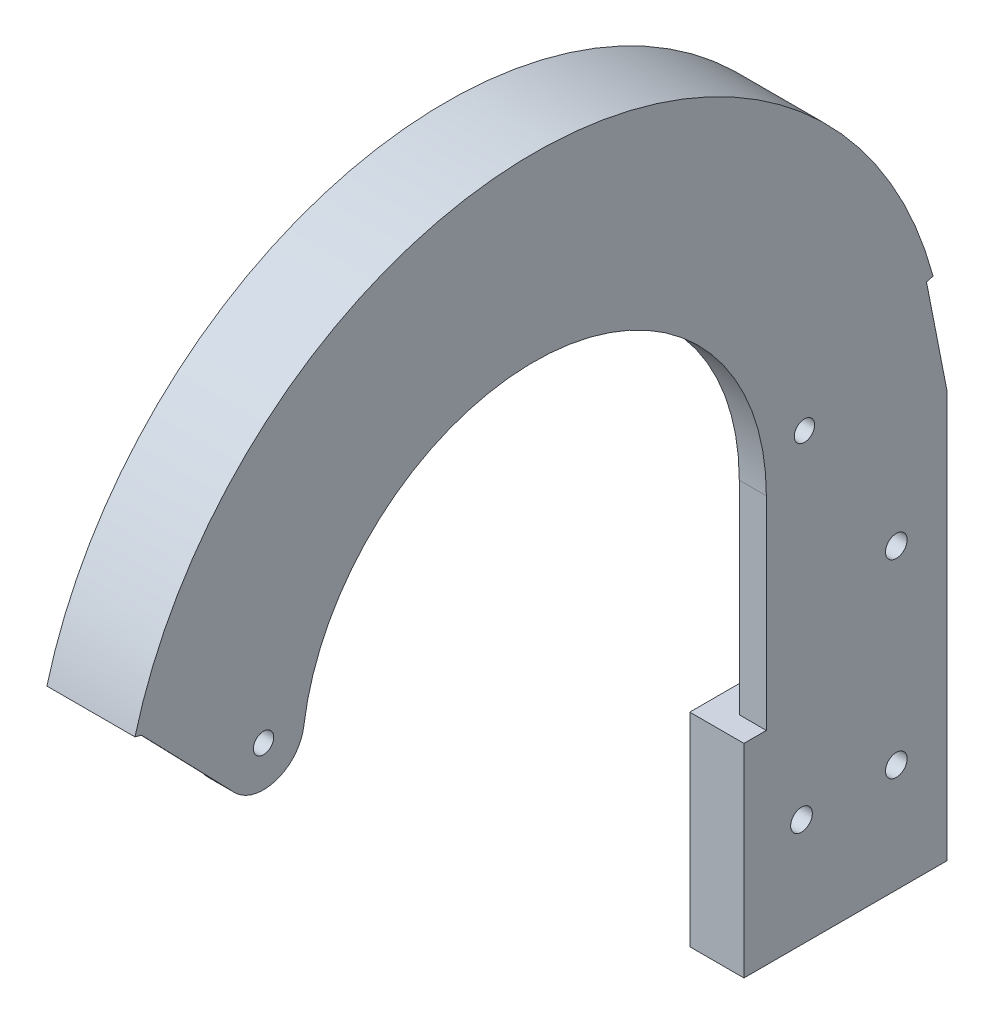
ISO-10303-21;
HEADER;
FILE_DESCRIPTION(('STEP AP214'),'2;1');
FILE_NAME('part.step','',(''),(''),'','','');
FILE_SCHEMA(('AUTOMOTIVE_DESIGN { 1 0 10303 214 1 1 1 1 }'));
ENDSEC;
DATA;
#1=APPLICATION_CONTEXT('core data for automotive mechanical design processes');
#2=APPLICATION_PROTOCOL_DEFINITION('international standard','automotive_design',2000,#1);
#3=PRODUCT_CONTEXT('',#1,'mechanical');
#4=PRODUCT('Part','Part','',(#3));
#5=PRODUCT_RELATED_PRODUCT_CATEGORY('part','',(#4));
#6=PRODUCT_DEFINITION_FORMATION('','',#4);
#7=PRODUCT_DEFINITION_CONTEXT('part definition',#1,'design');
#8=PRODUCT_DEFINITION('design','',#6,#7);
#9=PRODUCT_DEFINITION_SHAPE('','',#8);
#10=(LENGTH_UNIT() NAMED_UNIT(*) SI_UNIT(.MILLI.,.METRE.));
#11=(NAMED_UNIT(*) PLANE_ANGLE_UNIT() SI_UNIT($,.RADIAN.));
#12=(NAMED_UNIT(*) SI_UNIT($,.STERADIAN.) SOLID_ANGLE_UNIT());
#13=UNCERTAINTY_MEASURE_WITH_UNIT(LENGTH_MEASURE(1.E-05),#10,'distance_accuracy_value','');
#14=(GEOMETRIC_REPRESENTATION_CONTEXT(3) GLOBAL_UNCERTAINTY_ASSIGNED_CONTEXT((#13)) GLOBAL_UNIT_ASSIGNED_CONTEXT((#10,
#11,#12)) REPRESENTATION_CONTEXT('',''));
#15=CARTESIAN_POINT('',(0.,0.,0.));
#16=DIRECTION('',(0.,0.,1.));
#17=DIRECTION('',(1.,0.,0.));
#18=AXIS2_PLACEMENT_3D('',#15,#16,#17);
#19=CARTESIAN_POINT('',(-35.,0.,0.));
#20=DIRECTION('',(1.,0.,0.));
#21=DIRECTION('',(0.,0.,1.));
#22=AXIS2_PLACEMENT_3D('',#19,#20,#21);
#23=PLANE('',#22);
#24=CARTESIAN_POINT('',(-35.,65.5231326726555,-39.9311282770753));
#25=DIRECTION('',(-1.,0.,0.));
#26=DIRECTION('',(0.,0.,1.));
#27=AXIS2_PLACEMENT_3D('',#24,#25,#26);
#28=CIRCLE('',#27,1.5);
#29=CARTESIAN_POINT('',(-35.,65.5231326726555,-38.4311282770753));
#30=VERTEX_POINT('',#29);
#31=EDGE_CURVE('E269',#30,#30,#28,.T.);
#32=ORIENTED_EDGE('',*,*,#31,.F.);
#33=EDGE_LOOP('',(#32));
#34=FACE_BOUND('',#33,.T.);
#35=CARTESIAN_POINT('',(-35.,65.5231326726555,39.9311282770753));
#36=DIRECTION('',(-1.,0.,0.));
#37=DIRECTION('',(0.,0.,1.));
#38=AXIS2_PLACEMENT_3D('',#35,#36,#37);
#39=CIRCLE('',#38,1.5);
#40=CARTESIAN_POINT('',(-35.,65.5231326726555,41.4311282770753));
#41=VERTEX_POINT('',#40);
#42=EDGE_CURVE('E303',#41,#41,#39,.F.);
#43=ORIENTED_EDGE('',*,*,#42,.T.);
#44=EDGE_LOOP('',(#43));
#45=FACE_BOUND('',#44,.T.);
#46=DIRECTION('',(0.,0.,1.));
#47=VECTOR('',#46,1.);
#48=CARTESIAN_POINT('',(-35.,60.,-61.));
#49=LINE('',#48,#47);
#50=CARTESIAN_POINT('',(-35.,60.,-61.));
#51=VERTEX_POINT('',#50);
#52=CARTESIAN_POINT('',(-35.,60.,-46.));
#53=VERTEX_POINT('',#52);
#54=EDGE_CURVE('E206',#51,#53,#49,.T.);
#55=ORIENTED_EDGE('',*,*,#54,.T.);
#56=DIRECTION('',(0.,-1.,0.));
#57=VECTOR('',#56,1.);
#58=CARTESIAN_POINT('',(-35.,60.,-46.));
#59=LINE('',#58,#57);
#60=CARTESIAN_POINT('',(-35.,30.,-46.));
#61=VERTEX_POINT('',#60);
#62=EDGE_CURVE('E186',#53,#61,#59,.T.);
#63=ORIENTED_EDGE('',*,*,#62,.T.);
#64=DIRECTION('',(0.,0.,1.));
#65=VECTOR('',#64,1.);
#66=CARTESIAN_POINT('',(-35.,30.,-46.));
#67=LINE('',#66,#65);
#68=CARTESIAN_POINT('',(-35.,30.,-34.3112887414927));
#69=VERTEX_POINT('',#68);
#70=EDGE_CURVE('E195',#61,#69,#67,.T.);
#71=ORIENTED_EDGE('',*,*,#70,.T.);
#72=DIRECTION('',(0.,-1.,0.));
#73=VECTOR('',#72,1.);
#74=CARTESIAN_POINT('',(-35.,0.,-34.3112887414927));
#75=LINE('',#74,#73);
#76=CARTESIAN_POINT('',(-35.,60.,-34.3112887414928));
#77=VERTEX_POINT('',#76);
#78=EDGE_CURVE('E295',#77,#69,#75,.T.);
#79=ORIENTED_EDGE('',*,*,#78,.F.);
#80=CARTESIAN_POINT('',(-35.,60.,0.));
#81=DIRECTION('',(-1.,0.,0.));
#82=DIRECTION('',(0.,0.,1.));
#83=AXIS2_PLACEMENT_3D('',#80,#81,#82);
#84=CIRCLE('',#83,34.3112887414928);
#85=CARTESIAN_POINT('',(-35.,64.7010603184709,33.9877119998417));
#86=VERTEX_POINT('',#85);
#87=EDGE_CURVE('E297',#77,#86,#84,.F.);
#88=ORIENTED_EDGE('',*,*,#87,.T.);
#89=CARTESIAN_POINT('',(-35.,65.5231326726555,39.9311282770753));
#90=DIRECTION('',(-1.,0.,0.));
#91=DIRECTION('',(0.,0.,1.));
#92=AXIS2_PLACEMENT_3D('',#89,#90,#91);
#93=CIRCLE('',#92,6.00000000000001);
#94=CARTESIAN_POINT('',(-35.,66.3452050268401,45.874544554309));
#95=VERTEX_POINT('',#94);
#96=EDGE_CURVE('E300',#86,#95,#93,.T.);
#97=ORIENTED_EDGE('',*,*,#96,.T.);
#98=CARTESIAN_POINT('',(-35.,60.,0.));
#99=DIRECTION('',(-1.,0.,0.));
#100=DIRECTION('',(0.,0.,1.));
#101=AXIS2_PLACEMENT_3D('',#98,#99,#100);
#102=CIRCLE('',#101,46.3112887414928);
#103=CARTESIAN_POINT('',(-35.,90.1419665662354,-35.1595977852117));
#104=VERTEX_POINT('',#103);
#105=EDGE_CURVE('E261',#104,#95,#102,.F.);
#106=ORIENTED_EDGE('',*,*,#105,.F.);
#107=DIRECTION('',(0.,0.75920145477857,0.650855706790762));
#108=VECTOR('',#107,1.);
#109=CARTESIAN_POINT('',(-35.,55.5587556299615,-64.8074337520006));
#110=LINE('',#109,#108);
#111=EDGE_CURVE('E292',#51,#104,#110,.T.);
#112=ORIENTED_EDGE('',*,*,#111,.F.);
#113=EDGE_LOOP('',(#55,#63,#71,#79,#88,#97,#106,#112));
#114=FACE_BOUND('',#113,.T.);
#115=ADVANCED_FACE('F35',(#34,#45,#114),#23,.F.);
#116=CARTESIAN_POINT('',(-31.,60.,0.));
#117=DIRECTION('',(-1.,0.,0.));
#118=DIRECTION('',(0.,0.,-1.));
#119=AXIS2_PLACEMENT_3D('',#116,#117,#118);
#120=CYLINDRICAL_SURFACE('',#119,46.3112887414928);
#121=DIRECTION('',(-1.,0.,0.));
#122=VECTOR('',#121,1.);
#123=CARTESIAN_POINT('',(-31.,90.1419665662354,-35.1595977852117));
#124=LINE('',#123,#122);
#125=CARTESIAN_POINT('',(-34.,90.1419665662354,-35.1595977852117));
#126=VERTEX_POINT('',#125);
#127=EDGE_CURVE('E326',#126,#104,#124,.T.);
#128=ORIENTED_EDGE('',*,*,#127,.T.);
#129=ORIENTED_EDGE('',*,*,#105,.T.);
#130=DIRECTION('',(-1.,0.,0.));
#131=VECTOR('',#130,1.);
#132=CARTESIAN_POINT('',(-31.,66.3452050268401,45.874544554309));
#133=LINE('',#132,#131);
#134=CARTESIAN_POINT('',(-34.,66.3452050268401,45.874544554309));
#135=VERTEX_POINT('',#134);
#136=EDGE_CURVE('E289',#135,#95,#133,.T.);
#137=ORIENTED_EDGE('',*,*,#136,.F.);
#138=CARTESIAN_POINT('',(-34.,60.,0.));
#139=DIRECTION('',(-1.,0.,0.));
#140=DIRECTION('',(0.,0.,1.));
#141=AXIS2_PLACEMENT_3D('',#138,#139,#140);
#142=CIRCLE('',#141,46.3112887414928);
#143=EDGE_CURVE('E371',#126,#135,#142,.F.);
#144=ORIENTED_EDGE('',*,*,#143,.F.);
#145=EDGE_LOOP('',(#128,#129,#137,#144));
#146=FACE_BOUND('',#145,.T.);
#147=ADVANCED_FACE('F385',(#146),#120,.T.);
#148=CARTESIAN_POINT('',(-31.,55.5587556299615,-64.8074337520006));
#149=DIRECTION('',(0.,0.650855706790762,-0.75920145477857));
#150=DIRECTION('',(0.,-0.75920145477857,-0.650855706790762));
#151=AXIS2_PLACEMENT_3D('',#148,#149,#150);
#152=PLANE('',#151);
#153=DIRECTION('',(-1.,0.,0.));
#154=VECTOR('',#153,1.);
#155=CARTESIAN_POINT('',(-31.,60.,-61.));
#156=LINE('',#155,#154);
#157=CARTESIAN_POINT('',(-34.,60.,-61.));
#158=VERTEX_POINT('',#157);
#159=EDGE_CURVE('E323',#158,#51,#156,.T.);
#160=ORIENTED_EDGE('',*,*,#159,.T.);
#161=ORIENTED_EDGE('',*,*,#111,.T.);
#162=ORIENTED_EDGE('',*,*,#127,.F.);
#163=DIRECTION('',(0.,-0.75920145477857,-0.650855706790762));
#164=VECTOR('',#163,1.);
#165=CARTESIAN_POINT('',(-34.,55.5587556299615,-64.8074337520006));
#166=LINE('',#165,#164);
#167=EDGE_CURVE('E438',#158,#126,#166,.F.);
#168=ORIENTED_EDGE('',*,*,#167,.F.);
#169=EDGE_LOOP('',(#160,#161,#162,#168));
#170=FACE_BOUND('',#169,.T.);
#171=ADVANCED_FACE('F390',(#170),#152,.T.);
#172=CARTESIAN_POINT('',(-31.,65.5231326726555,39.9311282770753));
#173=DIRECTION('',(-1.,0.,0.));
#174=DIRECTION('',(0.,0.,-1.));
#175=AXIS2_PLACEMENT_3D('',#172,#173,#174);
#176=CYLINDRICAL_SURFACE('',#175,6.00000000000001);
#177=ORIENTED_EDGE('',*,*,#136,.T.);
#178=ORIENTED_EDGE('',*,*,#96,.F.);
#179=DIRECTION('',(-1.,0.,0.));
#180=VECTOR('',#179,1.);
#181=CARTESIAN_POINT('',(-31.,64.7010603184709,33.9877119998417));
#182=LINE('',#181,#180);
#183=CARTESIAN_POINT('',(-31.,64.7010603184709,33.9877119998417));
#184=VERTEX_POINT('',#183);
#185=EDGE_CURVE('E309',#184,#86,#182,.T.);
#186=ORIENTED_EDGE('',*,*,#185,.F.);
#187=CARTESIAN_POINT('',(-31.,65.5231326726555,39.9311282770753));
#188=DIRECTION('',(-1.,0.,0.));
#189=DIRECTION('',(0.,0.,1.));
#190=AXIS2_PLACEMENT_3D('',#187,#188,#189);
#191=CIRCLE('',#190,6.00000000000001);
#192=CARTESIAN_POINT('',(-31.,61.3519172032577,44.2440114783523));
#193=VERTEX_POINT('',#192);
#194=EDGE_CURVE('E280',#184,#193,#191,.T.);
#195=ORIENTED_EDGE('',*,*,#194,.T.);
#196=DIRECTION('',(1.,0.,0.));
#197=VECTOR('',#196,1.);
#198=CARTESIAN_POINT('',(-32.,61.3519172032577,44.2440114783523));
#199=LINE('',#198,#197);
#200=CARTESIAN_POINT('',(-34.,61.3519172032577,44.2440114783523));
#201=VERTEX_POINT('',#200);
#202=EDGE_CURVE('E258',#201,#193,#199,.T.);
#203=ORIENTED_EDGE('',*,*,#202,.F.);
#204=CARTESIAN_POINT('',(-34.,65.5231326726555,39.9311282770753));
#205=DIRECTION('',(-1.,0.,0.));
#206=DIRECTION('',(0.,0.,1.));
#207=AXIS2_PLACEMENT_3D('',#204,#205,#206);
#208=CIRCLE('',#207,6.00000000000001);
#209=EDGE_CURVE('E487',#135,#201,#208,.F.);
#210=ORIENTED_EDGE('',*,*,#209,.F.);
#211=EDGE_LOOP('',(#177,#178,#186,#195,#203,#210));
#212=FACE_BOUND('',#211,.T.);
#213=ADVANCED_FACE('F404',(#212),#176,.T.);
#214=CARTESIAN_POINT('',(-31.,0.,-61.));
#215=DIRECTION('',(0.,0.,1.));
#216=DIRECTION('',(-1.,0.,0.));
#217=AXIS2_PLACEMENT_3D('',#214,#215,#216);
#218=PLANE('',#217);
#219=ORIENTED_EDGE('',*,*,#159,.F.);
#220=CARTESIAN_POINT('',(-31.,60.,-61.));
#221=VERTEX_POINT('',#220);
#222=EDGE_CURVE('E324',#221,#158,#156,.T.);
#223=ORIENTED_EDGE('',*,*,#222,.F.);
#224=DIRECTION('',(0.,-1.,0.));
#225=VECTOR('',#224,1.);
#226=CARTESIAN_POINT('',(-31.,0.,-61.));
#227=LINE('',#226,#225);
#228=CARTESIAN_POINT('',(-31.,0.,-61.));
#229=VERTEX_POINT('',#228);
#230=EDGE_CURVE('E265',#221,#229,#227,.T.);
#231=ORIENTED_EDGE('',*,*,#230,.T.);
#232=DIRECTION('',(-1.,0.,0.));
#233=VECTOR('',#232,1.);
#234=CARTESIAN_POINT('',(-31.,0.,-61.));
#235=LINE('',#234,#233);
#236=CARTESIAN_POINT('',(-39.,0.,-61.));
#237=VERTEX_POINT('',#236);
#238=EDGE_CURVE('E320',#229,#237,#235,.T.);
#239=ORIENTED_EDGE('',*,*,#238,.T.);
#240=DIRECTION('',(0.,-1.,0.));
#241=VECTOR('',#240,1.);
#242=CARTESIAN_POINT('',(-39.,60.,-61.));
#243=LINE('',#242,#241);
#244=CARTESIAN_POINT('',(-39.,60.,-61.));
#245=VERTEX_POINT('',#244);
#246=EDGE_CURVE('E213',#245,#237,#243,.T.);
#247=ORIENTED_EDGE('',*,*,#246,.F.);
#248=DIRECTION('',(1.,0.,0.));
#249=VECTOR('',#248,1.);
#250=CARTESIAN_POINT('',(-106.082039324994,60.,-61.));
#251=LINE('',#250,#249);
#252=EDGE_CURVE('E192',#245,#51,#251,.T.);
#253=ORIENTED_EDGE('',*,*,#252,.T.);
#254=EDGE_LOOP('',(#219,#223,#231,#239,#247,#253));
#255=FACE_BOUND('',#254,.T.);
#256=ADVANCED_FACE('F407',(#255),#218,.F.);
#257=CARTESIAN_POINT('',(-31.,0.,0.));
#258=DIRECTION('',(0.,1.,0.));
#259=DIRECTION('',(0.,0.,-1.));
#260=AXIS2_PLACEMENT_3D('',#257,#258,#259);
#261=PLANE('',#260);
#262=ORIENTED_EDGE('',*,*,#238,.F.);
#263=DIRECTION('',(0.,0.,1.));
#264=VECTOR('',#263,1.);
#265=CARTESIAN_POINT('',(-31.,0.,0.));
#266=LINE('',#265,#264);
#267=CARTESIAN_POINT('',(-31.,0.,-31.));
#268=VERTEX_POINT('',#267);
#269=EDGE_CURVE('E268',#229,#268,#266,.T.);
#270=ORIENTED_EDGE('',*,*,#269,.T.);
#271=DIRECTION('',(-1.,0.,0.));
#272=VECTOR('',#271,1.);
#273=CARTESIAN_POINT('',(-31.,0.,-31.));
#274=LINE('',#273,#272);
#275=CARTESIAN_POINT('',(-39.,0.,-31.));
#276=VERTEX_POINT('',#275);
#277=EDGE_CURVE('E317',#268,#276,#274,.T.);
#278=ORIENTED_EDGE('',*,*,#277,.T.);
#279=DIRECTION('',(0.,0.,1.));
#280=VECTOR('',#279,1.);
#281=CARTESIAN_POINT('',(-39.,0.,-61.));
#282=LINE('',#281,#280);
#283=EDGE_CURVE('E216',#237,#276,#282,.T.);
#284=ORIENTED_EDGE('',*,*,#283,.F.);
#285=EDGE_LOOP('',(#262,#270,#278,#284));
#286=FACE_BOUND('',#285,.T.);
#287=ADVANCED_FACE('F421',(#286),#261,.F.);
#288=CARTESIAN_POINT('',(-31.,0.,-31.));
#289=DIRECTION('',(0.,0.,1.));
#290=DIRECTION('',(0.,1.,0.));
#291=AXIS2_PLACEMENT_3D('',#288,#289,#290);
#292=PLANE('',#291);
#293=ORIENTED_EDGE('',*,*,#277,.F.);
#294=DIRECTION('',(0.,-1.,0.));
#295=VECTOR('',#294,1.);
#296=CARTESIAN_POINT('',(-31.,0.,-31.));
#297=LINE('',#296,#295);
#298=CARTESIAN_POINT('',(-31.,30.,-31.));
#299=VERTEX_POINT('',#298);
#300=EDGE_CURVE('E272',#299,#268,#297,.T.);
#301=ORIENTED_EDGE('',*,*,#300,.F.);
#302=DIRECTION('',(-1.,0.,0.));
#303=VECTOR('',#302,1.);
#304=CARTESIAN_POINT('',(-31.,30.,-31.));
#305=LINE('',#304,#303);
#306=CARTESIAN_POINT('',(-39.,30.,-31.));
#307=VERTEX_POINT('',#306);
#308=EDGE_CURVE('E314',#299,#307,#305,.T.);
#309=ORIENTED_EDGE('',*,*,#308,.T.);
#310=DIRECTION('',(0.,1.,0.));
#311=VECTOR('',#310,1.);
#312=CARTESIAN_POINT('',(-39.,30.,-31.));
#313=LINE('',#312,#311);
#314=EDGE_CURVE('E454',#276,#307,#313,.T.);
#315=ORIENTED_EDGE('',*,*,#314,.F.);
#316=EDGE_LOOP('',(#293,#301,#309,#315));
#317=FACE_BOUND('',#316,.T.);
#318=ADVANCED_FACE('F418',(#317),#292,.T.);
#319=CARTESIAN_POINT('',(-31.,30.,0.));
#320=DIRECTION('',(0.,1.,0.));
#321=DIRECTION('',(0.,0.,-1.));
#322=AXIS2_PLACEMENT_3D('',#319,#320,#321);
#323=PLANE('',#322);
#324=ORIENTED_EDGE('',*,*,#308,.F.);
#325=DIRECTION('',(0.,0.,1.));
#326=VECTOR('',#325,1.);
#327=CARTESIAN_POINT('',(-31.,30.,0.));
#328=LINE('',#327,#326);
#329=CARTESIAN_POINT('',(-31.,30.,-34.3112887414927));
#330=VERTEX_POINT('',#329);
#331=EDGE_CURVE('E274',#330,#299,#328,.T.);
#332=ORIENTED_EDGE('',*,*,#331,.F.);
#333=DIRECTION('',(-1.,0.,0.));
#334=VECTOR('',#333,1.);
#335=CARTESIAN_POINT('',(-31.,30.,-34.3112887414927));
#336=LINE('',#335,#334);
#337=EDGE_CURVE('E200',#330,#69,#336,.T.);
#338=ORIENTED_EDGE('',*,*,#337,.T.);
#339=ORIENTED_EDGE('',*,*,#70,.F.);
#340=DIRECTION('',(1.,0.,0.));
#341=VECTOR('',#340,1.);
#342=CARTESIAN_POINT('',(-106.082039324994,30.,-46.));
#343=LINE('',#342,#341);
#344=CARTESIAN_POINT('',(-39.,30.,-46.));
#345=VERTEX_POINT('',#344);
#346=EDGE_CURVE('E182',#345,#61,#343,.T.);
#347=ORIENTED_EDGE('',*,*,#346,.F.);
#348=DIRECTION('',(0.,0.,-1.));
#349=VECTOR('',#348,1.);
#350=CARTESIAN_POINT('',(-39.,30.,-46.));
#351=LINE('',#350,#349);
#352=EDGE_CURVE('E450',#307,#345,#351,.T.);
#353=ORIENTED_EDGE('',*,*,#352,.F.);
#354=EDGE_LOOP('',(#324,#332,#338,#339,#347,#353));
#355=FACE_BOUND('',#354,.T.);
#356=ADVANCED_FACE('F197',(#355),#323,.T.);
#357=CARTESIAN_POINT('',(-31.,0.,-34.3112887414927));
#358=DIRECTION('',(0.,0.,1.));
#359=DIRECTION('',(0.,1.,0.));
#360=AXIS2_PLACEMENT_3D('',#357,#358,#359);
#361=PLANE('',#360);
#362=ORIENTED_EDGE('',*,*,#78,.T.);
#363=ORIENTED_EDGE('',*,*,#337,.F.);
#364=DIRECTION('',(0.,-1.,0.));
#365=VECTOR('',#364,1.);
#366=CARTESIAN_POINT('',(-31.,0.,-34.3112887414927));
#367=LINE('',#366,#365);
#368=CARTESIAN_POINT('',(-31.,60.,-34.3112887414928));
#369=VERTEX_POINT('',#368);
#370=EDGE_CURVE('E276',#369,#330,#367,.T.);
#371=ORIENTED_EDGE('',*,*,#370,.F.);
#372=DIRECTION('',(-1.,0.,0.));
#373=VECTOR('',#372,1.);
#374=CARTESIAN_POINT('',(-31.,60.,-34.3112887414928));
#375=LINE('',#374,#373);
#376=EDGE_CURVE('E311',#369,#77,#375,.T.);
#377=ORIENTED_EDGE('',*,*,#376,.T.);
#378=EDGE_LOOP('',(#362,#363,#371,#377));
#379=FACE_BOUND('',#378,.T.);
#380=ADVANCED_FACE('F411',(#379),#361,.T.);
#381=CARTESIAN_POINT('',(-31.,60.,0.));
#382=DIRECTION('',(-1.,0.,0.));
#383=DIRECTION('',(0.,0.,-1.));
#384=AXIS2_PLACEMENT_3D('',#381,#382,#383);
#385=CYLINDRICAL_SURFACE('',#384,34.3112887414928);
#386=ORIENTED_EDGE('',*,*,#87,.F.);
#387=ORIENTED_EDGE('',*,*,#376,.F.);
#388=CARTESIAN_POINT('',(-31.,60.,0.));
#389=DIRECTION('',(-1.,0.,0.));
#390=DIRECTION('',(0.,0.,1.));
#391=AXIS2_PLACEMENT_3D('',#388,#389,#390);
#392=CIRCLE('',#391,34.3112887414928);
#393=EDGE_CURVE('E278',#369,#184,#392,.F.);
#394=ORIENTED_EDGE('',*,*,#393,.T.);
#395=ORIENTED_EDGE('',*,*,#185,.T.);
#396=EDGE_LOOP('',(#386,#387,#394,#395));
#397=FACE_BOUND('',#396,.T.);
#398=ADVANCED_FACE('F402',(#397),#385,.F.);
#399=CARTESIAN_POINT('',(-31.,65.5231326726555,39.9311282770753));
#400=DIRECTION('',(-1.,0.,0.));
#401=DIRECTION('',(0.,0.,-1.));
#402=AXIS2_PLACEMENT_3D('',#399,#400,#401);
#403=CYLINDRICAL_SURFACE('',#402,1.5);
#404=CARTESIAN_POINT('',(-31.,65.5231326726555,39.9311282770753));
#405=DIRECTION('',(-1.,0.,0.));
#406=DIRECTION('',(0.,0.,1.));
#407=AXIS2_PLACEMENT_3D('',#404,#405,#406);
#408=CIRCLE('',#407,1.5);
#409=CARTESIAN_POINT('',(-31.,65.5231326726555,41.4311282770753));
#410=VERTEX_POINT('',#409);
#411=EDGE_CURVE('E283',#410,#410,#408,.F.);
#412=ORIENTED_EDGE('',*,*,#411,.T.);
#413=EDGE_LOOP('',(#412));
#414=FACE_BOUND('',#413,.T.);
#415=ORIENTED_EDGE('',*,*,#42,.F.);
#416=EDGE_LOOP('',(#415));
#417=FACE_BOUND('',#416,.T.);
#418=ADVANCED_FACE('F398',(#414,#417),#403,.F.);
#419=CARTESIAN_POINT('',(-31.,65.5231326726555,-39.9311282770753));
#420=DIRECTION('',(-1.,0.,0.));
#421=DIRECTION('',(0.,0.,-1.));
#422=AXIS2_PLACEMENT_3D('',#419,#420,#421);
#423=CYLINDRICAL_SURFACE('',#422,1.5);
#424=CARTESIAN_POINT('',(-31.,65.5231326726555,-39.9311282770753));
#425=DIRECTION('',(-1.,0.,0.));
#426=DIRECTION('',(0.,0.,1.));
#427=AXIS2_PLACEMENT_3D('',#424,#425,#426);
#428=CIRCLE('',#427,1.5);
#429=CARTESIAN_POINT('',(-31.,65.5231326726555,-38.4311282770753));
#430=VERTEX_POINT('',#429);
#431=EDGE_CURVE('E286',#430,#430,#428,.T.);
#432=ORIENTED_EDGE('',*,*,#431,.F.);
#433=EDGE_LOOP('',(#432));
#434=FACE_BOUND('',#433,.T.);
#435=ORIENTED_EDGE('',*,*,#31,.T.);
#436=EDGE_LOOP('',(#435));
#437=FACE_BOUND('',#436,.T.);
#438=ADVANCED_FACE('F395',(#434,#437),#423,.F.);
#439=CARTESIAN_POINT('',(-31.,0.,0.));
#440=DIRECTION('',(1.,0.,0.));
#441=DIRECTION('',(0.,0.,1.));
#442=AXIS2_PLACEMENT_3D('',#439,#440,#441);
#443=PLANE('',#442);
#444=CARTESIAN_POINT('',(-31.,44.,-53.5));
#445=DIRECTION('',(-1.,0.,0.));
#446=DIRECTION('',(0.,0.,1.));
#447=AXIS2_PLACEMENT_3D('',#444,#445,#446);
#448=CIRCLE('',#447,1.6);
#449=CARTESIAN_POINT('',(-31.,44.,-51.9));
#450=VERTEX_POINT('',#449);
#451=EDGE_CURVE('E463',#450,#450,#448,.T.);
#452=ORIENTED_EDGE('',*,*,#451,.T.);
#453=EDGE_LOOP('',(#452));
#454=FACE_BOUND('',#453,.T.);
#455=CARTESIAN_POINT('',(-31.,16.,-53.5));
#456=DIRECTION('',(-1.,0.,0.));
#457=DIRECTION('',(0.,0.,1.));
#458=AXIS2_PLACEMENT_3D('',#455,#456,#457);
#459=CIRCLE('',#458,1.6);
#460=CARTESIAN_POINT('',(-31.,16.,-51.9));
#461=VERTEX_POINT('',#460);
#462=EDGE_CURVE('E460',#461,#461,#459,.T.);
#463=ORIENTED_EDGE('',*,*,#462,.T.);
#464=EDGE_LOOP('',(#463));
#465=FACE_BOUND('',#464,.T.);
#466=CARTESIAN_POINT('',(-31.,16.,-39.5));
#467=DIRECTION('',(-1.,0.,0.));
#468=DIRECTION('',(0.,0.,1.));
#469=AXIS2_PLACEMENT_3D('',#466,#467,#468);
#470=CIRCLE('',#469,1.6);
#471=CARTESIAN_POINT('',(-31.,16.,-37.9));
#472=VERTEX_POINT('',#471);
#473=EDGE_CURVE('E457',#472,#472,#470,.T.);
#474=ORIENTED_EDGE('',*,*,#473,.T.);
#475=EDGE_LOOP('',(#474));
#476=FACE_BOUND('',#475,.T.);
#477=ORIENTED_EDGE('',*,*,#194,.F.);
#478=ORIENTED_EDGE('',*,*,#393,.F.);
#479=ORIENTED_EDGE('',*,*,#370,.T.);
#480=ORIENTED_EDGE('',*,*,#331,.T.);
#481=ORIENTED_EDGE('',*,*,#300,.T.);
#482=ORIENTED_EDGE('',*,*,#269,.F.);
#483=ORIENTED_EDGE('',*,*,#230,.F.);
#484=DIRECTION('',(0.,-0.981319470810539,-0.192385280643097));
#485=VECTOR('',#484,1.);
#486=CARTESIAN_POINT('',(-31.,13.7370025018251,-70.0697474388497));
#487=LINE('',#486,#485);
#488=CARTESIAN_POINT('',(-31.,75.5291427061513,-57.9555495773441));
#489=VERTEX_POINT('',#488);
#490=EDGE_CURVE('E252',#489,#221,#487,.T.);
#491=ORIENTED_EDGE('',*,*,#490,.F.);
#492=DIRECTION('',(0.,0.258819045102527,-0.965925826289067));
#493=VECTOR('',#492,1.);
#494=CARTESIAN_POINT('',(-31.,55.9807621135326,15.0000000000002));
#495=LINE('',#494,#493);
#496=CARTESIAN_POINT('',(-31.,75.7879617512538,-58.9214754036332));
#497=VERTEX_POINT('',#496);
#498=EDGE_CURVE('E220',#489,#497,#495,.T.);
#499=ORIENTED_EDGE('',*,*,#498,.T.);
#500=CARTESIAN_POINT('',(-31.,60.,0.));
#501=DIRECTION('',(-1.,0.,0.));
#502=DIRECTION('',(0.,0.,1.));
#503=AXIS2_PLACEMENT_3D('',#500,#501,#502);
#504=CIRCLE('',#503,61.);
#505=CARTESIAN_POINT('',(-31.,75.7879617512538,58.9214754036332));
#506=VERTEX_POINT('',#505);
#507=EDGE_CURVE('E232',#506,#497,#504,.T.);
#508=ORIENTED_EDGE('',*,*,#507,.F.);
#509=DIRECTION('',(0.,-0.258819045102527,-0.965925826289067));
#510=VECTOR('',#509,1.);
#511=CARTESIAN_POINT('',(-31.,55.9807621135326,-15.0000000000002));
#512=LINE('',#511,#510);
#513=CARTESIAN_POINT('',(-31.,75.5291427061513,57.9555495773441));
#514=VERTEX_POINT('',#513);
#515=EDGE_CURVE('E229',#506,#514,#512,.T.);
#516=ORIENTED_EDGE('',*,*,#515,.T.);
#517=DIRECTION('',(0.,-0.718813866879486,-0.695202578232964));
#518=VECTOR('',#517,1.);
#519=CARTESIAN_POINT('',(-31.,7.54211515049408,-7.79826934698205));
#520=LINE('',#519,#518);
#521=EDGE_CURVE('E241',#514,#193,#520,.T.);
#522=ORIENTED_EDGE('',*,*,#521,.T.);
#523=EDGE_LOOP('',(#477,#478,#479,#480,#481,#482,#483,#491,#499,#508,#516,#522));
#524=FACE_BOUND('',#523,.T.);
#525=ORIENTED_EDGE('',*,*,#411,.F.);
#526=EDGE_LOOP('',(#525));
#527=FACE_BOUND('',#526,.T.);
#528=ORIENTED_EDGE('',*,*,#431,.T.);
#529=EDGE_LOOP('',(#528));
#530=FACE_BOUND('',#529,.T.);
#531=ADVANCED_FACE('F359',(#454,#465,#476,#524,#527,#530),#443,.T.);
#532=CARTESIAN_POINT('',(-32.,7.54211515049408,-7.79826934698205));
#533=DIRECTION('',(0.,0.695202578232964,-0.718813866879486));
#534=DIRECTION('',(0.,-0.718813866879486,-0.695202578232964));
#535=AXIS2_PLACEMENT_3D('',#532,#533,#534);
#536=PLANE('',#535);
#537=ORIENTED_EDGE('',*,*,#521,.F.);
#538=DIRECTION('',(1.,0.,0.));
#539=VECTOR('',#538,1.);
#540=CARTESIAN_POINT('',(-32.,75.5291427061513,57.9555495773441));
#541=LINE('',#540,#539);
#542=CARTESIAN_POINT('',(-33.,75.5291427061513,57.9555495773441));
#543=VERTEX_POINT('',#542);
#544=EDGE_CURVE('E255',#543,#514,#541,.T.);
#545=ORIENTED_EDGE('',*,*,#544,.F.);
#546=CARTESIAN_POINT('',(-32.,74.6883597828302,57.1423843297612));
#547=CARTESIAN_POINT('',(-31.9999809301489,74.7494211712433,57.201439999958));
#548=CARTESIAN_POINT('',(-32.0078672991521,74.8105952622503,57.2606046707422));
#549=CARTESIAN_POINT('',(-32.0396066694051,74.9312206120607,57.3772677709583));
#550=CARTESIAN_POINT('',(-32.0635776459383,74.9906557298683,57.4347505895868));
#551=CARTESIAN_POINT('',(-32.1239236587169,75.0982443333996,57.5388051689567));
#552=CARTESIAN_POINT('',(-32.1585345978317,75.1469063552396,57.585868761639));
#553=CARTESIAN_POINT('',(-32.2400489024963,75.2384095548671,57.6743663035322));
#554=CARTESIAN_POINT('',(-32.2868997007796,75.2812744630643,57.7158232036666));
#555=CARTESIAN_POINT('',(-32.377900763892,75.3484883750029,57.780829301943));
#556=CARTESIAN_POINT('',(-32.4193819182083,75.3747153202167,57.806194755744));
#557=CARTESIAN_POINT('',(-32.5078729983627,75.421894080043,57.8518238079651));
#558=CARTESIAN_POINT('',(-32.5548844510945,75.4428444327705,57.8720859925195));
#559=CARTESIAN_POINT('',(-32.653631582464,75.4785472133586,57.9066160235312));
#560=CARTESIAN_POINT('',(-32.7053936054764,75.4932621773119,57.9208476366792));
#561=CARTESIAN_POINT('',(-32.8117891688431,75.5154362323473,57.9422933278948));
#562=CARTESIAN_POINT('',(-32.8664152881815,75.5229131845393,57.949524680378));
#563=CARTESIAN_POINT('',(-32.9344997046365,75.5274157649161,57.9538793619316));
#564=CARTESIAN_POINT('',(-32.9475930213956,75.528063482919,57.9545058039723));
#565=CARTESIAN_POINT('',(-32.9737890107529,75.5289262253507,57.9553402074118));
#566=CARTESIAN_POINT('',(-32.986891645086,75.5291418496221,57.9555487489498));
#567=CARTESIAN_POINT('',(-33.,75.5291427061513,57.9555495773441));
#568=B_SPLINE_CURVE_WITH_KNOTS('',3,(#546,#547,#548,#549,#550,#551,#552,#553,#554,#555,#556,
#557,#558,#559,#560,#561,#562,#563,#564,#565,#566,#567),.UNSPECIFIED.,.F.,.F.,(4,2,2,2,2,2,2,2,
2,2,4),(0.,0.254750306744904,0.511389849252014,0.738221031538455,0.964093600863932,
1.12915244565059,1.29425696996932,1.46033988529001,1.62601190810555,1.66537679690765,
1.70468700049572),.UNSPECIFIED.);
#569=CARTESIAN_POINT('',(-32.,74.6883597828302,57.1423843297612));
#570=VERTEX_POINT('',#569);
#571=EDGE_CURVE('E338',#570,#543,#568,.T.);
#572=ORIENTED_EDGE('',*,*,#571,.F.);
#573=DIRECTION('',(0.,-0.718813866879486,-0.695202578232964));
#574=VECTOR('',#573,1.);
#575=CARTESIAN_POINT('',(-32.,7.54211515049408,-7.79826934698205));
#576=LINE('',#575,#574);
#577=CARTESIAN_POINT('',(-32.,65.1555226646734,47.922677743983));
#578=VERTEX_POINT('',#577);
#579=EDGE_CURVE('E248',#570,#578,#576,.T.);
#580=ORIENTED_EDGE('',*,*,#579,.T.);
#581=CARTESIAN_POINT('',(-32.,65.1555226646733,47.922677743983));
#582=CARTESIAN_POINT('',(-32.0000393237185,65.0468656235527,47.817589822602));
#583=CARTESIAN_POINT('',(-32.0074908086163,64.9383370286525,47.7126261282951));
#584=CARTESIAN_POINT('',(-32.0352974881454,64.7223526762247,47.5037363369537));
#585=CARTESIAN_POINT('',(-32.0556250650501,64.6148951212699,47.399808501533));
#586=CARTESIAN_POINT('',(-32.1069097213006,64.4029283758736,47.1948043485958));
#587=CARTESIAN_POINT('',(-32.1377103669891,64.2983990009436,47.0937085096022));
#588=CARTESIAN_POINT('',(-32.2084801810369,64.0909136858633,46.893038582886));
#589=CARTESIAN_POINT('',(-32.2484546789471,63.9879586975832,46.7934654157669));
#590=CARTESIAN_POINT('',(-32.3880477943093,63.6630005451085,46.4791813488791));
#591=CARTESIAN_POINT('',(-32.5022836971677,63.4442400544996,46.2676066087491));
#592=CARTESIAN_POINT('',(-32.7558081690639,63.0143821418132,45.8518684838424));
#593=CARTESIAN_POINT('',(-32.8951255919297,62.8032938856094,45.6477139638628));
#594=CARTESIAN_POINT('',(-33.3381210802978,62.175986866917,45.0410124562361));
#595=CARTESIAN_POINT('',(-33.6653306728644,61.768588002629,44.6469956545679));
#596=CARTESIAN_POINT('',(-33.9948360545475,61.3583464525316,44.250229542412));
#597=CARTESIAN_POINT('',(-33.9974180439663,61.3551318190862,44.247120501863));
#598=CARTESIAN_POINT('',(-34.,61.3519172032577,44.2440114783523));
#599=B_SPLINE_CURVE_WITH_KNOTS('',3,(#581,#582,#583,#584,#585,#586,#587,#588,#589,#590,#591,
#592,#593,#594,#595,#596,#597,#598),.UNSPECIFIED.,.F.,.F.,(4,2,2,2,2,2,2,2,4),(0.,
0.453047985180413,0.905127510179343,1.35073120962172,1.79659444088084,2.76988627913991,
3.7443050333398,5.70583133706973,5.72132327058447),.UNSPECIFIED.);
#600=EDGE_CURVE('E44',#201,#578,#599,.F.);
#601=ORIENTED_EDGE('',*,*,#600,.F.);
#602=ORIENTED_EDGE('',*,*,#202,.T.);
#603=EDGE_LOOP('',(#537,#545,#572,#580,#601,#602));
#604=FACE_BOUND('',#603,.T.);
#605=ADVANCED_FACE('F353',(#604),#536,.F.);
#606=CARTESIAN_POINT('',(-32.,13.7370025018251,-70.0697474388497));
#607=DIRECTION('',(0.,0.192385280643097,-0.981319470810539));
#608=DIRECTION('',(0.,-0.981319470810539,-0.192385280643097));
#609=AXIS2_PLACEMENT_3D('',#606,#607,#608);
#610=PLANE('',#609);
#611=ORIENTED_EDGE('',*,*,#490,.T.);
#612=ORIENTED_EDGE('',*,*,#222,.T.);
#613=CARTESIAN_POINT('',(-34.,63.9839358178617,-60.2189591329006));
#614=DIRECTION('',(0.,-0.192385280643097,0.981319470810539));
#615=DIRECTION('',(0.,-0.981319470810539,-0.192385280643097));
#616=AXIS2_PLACEMENT_3D('',#613,#614,#615);
#617=ELLIPSE('',#616,4.05977455493782,2.);
#618=CARTESIAN_POINT('',(-32.,63.9839358178617,-60.2189591329006));
#619=VERTEX_POINT('',#618);
#620=EDGE_CURVE('E11',#619,#158,#617,.F.);
#621=ORIENTED_EDGE('',*,*,#620,.F.);
#622=DIRECTION('',(0.,-0.981319470810539,-0.192385280643097));
#623=VECTOR('',#622,1.);
#624=CARTESIAN_POINT('',(-32.,13.7370025018251,-70.0697474388497));
#625=LINE('',#624,#623);
#626=CARTESIAN_POINT('',(-32.,75.5291427061513,-57.9555495773441));
#627=VERTEX_POINT('',#626);
#628=EDGE_CURVE('E251',#627,#619,#625,.T.);
#629=ORIENTED_EDGE('',*,*,#628,.F.);
#630=DIRECTION('',(1.,0.,0.));
#631=VECTOR('',#630,1.);
#632=CARTESIAN_POINT('',(-32.,75.5291427061513,-57.9555495773441));
#633=LINE('',#632,#631);
#634=EDGE_CURVE('E262',#627,#489,#633,.T.);
#635=ORIENTED_EDGE('',*,*,#634,.T.);
#636=EDGE_LOOP('',(#611,#612,#621,#629,#635));
#637=FACE_BOUND('',#636,.T.);
#638=ADVANCED_FACE('F358',(#637),#610,.T.);
#639=CARTESIAN_POINT('',(-32.,0.,0.));
#640=DIRECTION('',(1.,0.,0.));
#641=DIRECTION('',(0.,0.,1.));
#642=AXIS2_PLACEMENT_3D('',#639,#640,#641);
#643=PLANE('',#642);
#644=ORIENTED_EDGE('',*,*,#579,.F.);
#645=CARTESIAN_POINT('',(-32.,60.,0.));
#646=DIRECTION('',(-1.,0.,0.));
#647=DIRECTION('',(0.,0.,1.));
#648=AXIS2_PLACEMENT_3D('',#645,#646,#647);
#649=CIRCLE('',#648,59.);
#650=CARTESIAN_POINT('',(-32.,75.2703236610487,-56.989623751055));
#651=VERTEX_POINT('',#650);
#652=EDGE_CURVE('E331',#651,#570,#649,.F.);
#653=ORIENTED_EDGE('',*,*,#652,.F.);
#654=DIRECTION('',(0.,-0.258819045102527,0.965925826289067));
#655=VECTOR('',#654,1.);
#656=CARTESIAN_POINT('',(-32.,55.9807621135326,15.0000000000002));
#657=LINE('',#656,#655);
#658=EDGE_CURVE('E333',#627,#651,#657,.T.);
#659=ORIENTED_EDGE('',*,*,#658,.F.);
#660=ORIENTED_EDGE('',*,*,#628,.T.);
#661=DIRECTION('',(0.,-0.75920145477857,-0.650855706790762));
#662=VECTOR('',#661,1.);
#663=CARTESIAN_POINT('',(-32.,56.8604670435431,-66.3258366615578));
#664=LINE('',#663,#662);
#665=CARTESIAN_POINT('',(-32.,91.4436779798169,-36.6780006947688));
#666=VERTEX_POINT('',#665);
#667=EDGE_CURVE('E477',#666,#619,#664,.T.);
#668=ORIENTED_EDGE('',*,*,#667,.F.);
#669=CARTESIAN_POINT('',(-32.,60.,0.));
#670=DIRECTION('',(-1.,0.,0.));
#671=DIRECTION('',(0.,0.,1.));
#672=AXIS2_PLACEMENT_3D('',#669,#670,#671);
#673=CIRCLE('',#672,48.3112887414928);
#674=CARTESIAN_POINT('',(-32.,66.6192291449016,47.8556833133868));
#675=VERTEX_POINT('',#674);
#676=EDGE_CURVE('E347',#675,#666,#673,.T.);
#677=ORIENTED_EDGE('',*,*,#676,.F.);
#678=CARTESIAN_POINT('',(-32.,65.5231326726555,39.9311282770753));
#679=DIRECTION('',(-1.,0.,0.));
#680=DIRECTION('',(0.,0.,1.));
#681=AXIS2_PLACEMENT_3D('',#678,#679,#680);
#682=CIRCLE('',#681,8.00000000000001);
#683=EDGE_CURVE('E486',#578,#675,#682,.T.);
#684=ORIENTED_EDGE('',*,*,#683,.F.);
#685=EDGE_LOOP('',(#644,#653,#659,#660,#668,#677,#684));
#686=FACE_BOUND('',#685,.T.);
#687=ADVANCED_FACE('F484',(#686),#643,.F.);
#688=CARTESIAN_POINT('',(-44.,60.,0.));
#689=DIRECTION('',(1.,0.,0.));
#690=DIRECTION('',(0.,0.,1.));
#691=AXIS2_PLACEMENT_3D('',#688,#689,#690);
#692=CYLINDRICAL_SURFACE('',#691,60.);
#693=DIRECTION('',(1.,0.,0.));
#694=VECTOR('',#693,1.);
#695=CARTESIAN_POINT('',(-44.,75.5291427061513,57.9555495773441));
#696=LINE('',#695,#694);
#697=CARTESIAN_POINT('',(-44.,75.5291427061513,57.9555495773441));
#698=VERTEX_POINT('',#697);
#699=EDGE_CURVE('E238',#698,#543,#696,.T.);
#700=ORIENTED_EDGE('',*,*,#699,.F.);
#701=CARTESIAN_POINT('',(-44.,60.,0.));
#702=DIRECTION('',(-1.,0.,0.));
#703=DIRECTION('',(0.,0.,1.));
#704=AXIS2_PLACEMENT_3D('',#701,#702,#703);
#705=CIRCLE('',#704,60.);
#706=CARTESIAN_POINT('',(-44.,75.5291427061513,-57.9555495773441));
#707=VERTEX_POINT('',#706);
#708=EDGE_CURVE('E225',#698,#707,#705,.T.);
#709=ORIENTED_EDGE('',*,*,#708,.T.);
#710=DIRECTION('',(1.,0.,0.));
#711=VECTOR('',#710,1.);
#712=CARTESIAN_POINT('',(-44.,75.5291427061513,-57.9555495773441));
#713=LINE('',#712,#711);
#714=CARTESIAN_POINT('',(-33.,75.5291427061513,-57.9555495773441));
#715=VERTEX_POINT('',#714);
#716=EDGE_CURVE('E242',#707,#715,#713,.T.);
#717=ORIENTED_EDGE('',*,*,#716,.T.);
#718=CARTESIAN_POINT('',(-33.,60.,0.));
#719=DIRECTION('',(-1.,0.,0.));
#720=DIRECTION('',(0.,0.,1.));
#721=AXIS2_PLACEMENT_3D('',#718,#719,#720);
#722=CIRCLE('',#721,60.);
#723=EDGE_CURVE('E328',#543,#715,#722,.T.);
#724=ORIENTED_EDGE('',*,*,#723,.F.);
#725=EDGE_LOOP('',(#700,#709,#717,#724));
#726=FACE_BOUND('',#725,.T.);
#727=ADVANCED_FACE('F526',(#726),#692,.F.);
#728=CARTESIAN_POINT('',(-44.,55.9807621135326,-15.0000000000002));
#729=DIRECTION('',(0.,0.965925826289067,-0.258819045102527));
#730=DIRECTION('',(0.,-0.258819045102527,-0.965925826289067));
#731=AXIS2_PLACEMENT_3D('',#728,#729,#730);
#732=PLANE('',#731);
#733=ORIENTED_EDGE('',*,*,#515,.F.);
#734=DIRECTION('',(1.,0.,0.));
#735=VECTOR('',#734,1.);
#736=CARTESIAN_POINT('',(-44.,75.7879617512538,58.9214754036332));
#737=LINE('',#736,#735);
#738=CARTESIAN_POINT('',(-44.,75.7879617512538,58.9214754036332));
#739=VERTEX_POINT('',#738);
#740=EDGE_CURVE('E228',#739,#506,#737,.T.);
#741=ORIENTED_EDGE('',*,*,#740,.F.);
#742=DIRECTION('',(0.,-0.258819045102527,-0.965925826289067));
#743=VECTOR('',#742,1.);
#744=CARTESIAN_POINT('',(-44.,55.9807621135326,-15.0000000000002));
#745=LINE('',#744,#743);
#746=EDGE_CURVE('E217',#739,#698,#745,.T.);
#747=ORIENTED_EDGE('',*,*,#746,.T.);
#748=ORIENTED_EDGE('',*,*,#699,.T.);
#749=ORIENTED_EDGE('',*,*,#544,.T.);
#750=EDGE_LOOP('',(#733,#741,#747,#748,#749));
#751=FACE_BOUND('',#750,.T.);
#752=ADVANCED_FACE('F521',(#751),#732,.F.);
#753=CARTESIAN_POINT('',(-44.,55.9807621135326,15.0000000000002));
#754=DIRECTION('',(0.,0.965925826289067,0.258819045102527));
#755=DIRECTION('',(0.,0.258819045102527,-0.965925826289067));
#756=AXIS2_PLACEMENT_3D('',#753,#754,#755);
#757=PLANE('',#756);
#758=ORIENTED_EDGE('',*,*,#498,.F.);
#759=ORIENTED_EDGE('',*,*,#634,.F.);
#760=ORIENTED_EDGE('',*,*,#658,.T.);
#761=CARTESIAN_POINT('',(-33.,75.2703236610491,-56.9896237510549));
#762=DIRECTION('',(0.,-0.965925826289067,-0.258819045102527));
#763=DIRECTION('',(0.,0.258819045102527,-0.965925826289067));
#764=AXIS2_PLACEMENT_3D('',#761,#762,#763);
#765=CIRCLE('',#764,1.);
#766=EDGE_CURVE('E336',#715,#651,#765,.T.);
#767=ORIENTED_EDGE('',*,*,#766,.F.);
#768=ORIENTED_EDGE('',*,*,#716,.F.);
#769=DIRECTION('',(0.,0.258819045102527,-0.965925826289067));
#770=VECTOR('',#769,1.);
#771=CARTESIAN_POINT('',(-44.,55.9807621135326,15.0000000000002));
#772=LINE('',#771,#770);
#773=CARTESIAN_POINT('',(-44.,75.7879617512538,-58.9214754036332));
#774=VERTEX_POINT('',#773);
#775=EDGE_CURVE('E222',#707,#774,#772,.T.);
#776=ORIENTED_EDGE('',*,*,#775,.T.);
#777=DIRECTION('',(1.,0.,0.));
#778=VECTOR('',#777,1.);
#779=CARTESIAN_POINT('',(-44.,75.7879617512538,-58.9214754036332));
#780=LINE('',#779,#778);
#781=EDGE_CURVE('E245',#774,#497,#780,.T.);
#782=ORIENTED_EDGE('',*,*,#781,.T.);
#783=EDGE_LOOP('',(#758,#759,#760,#767,#768,#776,#782));
#784=FACE_BOUND('',#783,.T.);
#785=ADVANCED_FACE('F505',(#784),#757,.F.);
#786=CARTESIAN_POINT('',(-44.,60.,0.));
#787=DIRECTION('',(1.,0.,0.));
#788=DIRECTION('',(0.,0.,1.));
#789=AXIS2_PLACEMENT_3D('',#786,#787,#788);
#790=CYLINDRICAL_SURFACE('',#789,61.);
#791=ORIENTED_EDGE('',*,*,#507,.T.);
#792=ORIENTED_EDGE('',*,*,#781,.F.);
#793=CARTESIAN_POINT('',(-44.,60.,0.));
#794=DIRECTION('',(-1.,0.,0.));
#795=DIRECTION('',(0.,0.,1.));
#796=AXIS2_PLACEMENT_3D('',#793,#794,#795);
#797=CIRCLE('',#796,61.);
#798=EDGE_CURVE('E219',#739,#774,#797,.T.);
#799=ORIENTED_EDGE('',*,*,#798,.F.);
#800=ORIENTED_EDGE('',*,*,#740,.T.);
#801=EDGE_LOOP('',(#791,#792,#799,#800));
#802=FACE_BOUND('',#801,.T.);
#803=ADVANCED_FACE('F531',(#802),#790,.T.);
#804=CARTESIAN_POINT('',(-44.,0.,0.));
#805=DIRECTION('',(1.,0.,0.));
#806=DIRECTION('',(0.,0.,1.));
#807=AXIS2_PLACEMENT_3D('',#804,#805,#806);
#808=PLANE('',#807);
#809=ORIENTED_EDGE('',*,*,#746,.F.);
#810=ORIENTED_EDGE('',*,*,#798,.T.);
#811=ORIENTED_EDGE('',*,*,#775,.F.);
#812=ORIENTED_EDGE('',*,*,#708,.F.);
#813=EDGE_LOOP('',(#809,#810,#811,#812));
#814=FACE_BOUND('',#813,.T.);
#815=ADVANCED_FACE('F529',(#814),#808,.F.);
#816=CARTESIAN_POINT('',(-33.,60.,0.));
#817=DIRECTION('',(1.,0.,0.));
#818=DIRECTION('',(0.,0.,1.));
#819=AXIS2_PLACEMENT_3D('',#816,#817,#818);
#820=TOROIDAL_SURFACE('',#819,59.,1.);
#821=ORIENTED_EDGE('',*,*,#571,.T.);
#822=ORIENTED_EDGE('',*,*,#723,.T.);
#823=ORIENTED_EDGE('',*,*,#766,.T.);
#824=ORIENTED_EDGE('',*,*,#652,.T.);
#825=EDGE_LOOP('',(#821,#822,#823,#824));
#826=FACE_BOUND('',#825,.T.);
#827=ADVANCED_FACE('F349',(#826),#820,.F.);
#828=CARTESIAN_POINT('',(-34.,56.8604670435431,-66.3258366615578));
#829=DIRECTION('',(0.,-0.75920145477857,-0.650855706790762));
#830=DIRECTION('',(0.,-0.650855706790762,0.75920145477857));
#831=AXIS2_PLACEMENT_3D('',#828,#829,#830);
#832=CYLINDRICAL_SURFACE('',#831,2.);
#833=ORIENTED_EDGE('',*,*,#620,.T.);
#834=ORIENTED_EDGE('',*,*,#167,.T.);
#835=CARTESIAN_POINT('',(-34.,91.4436779798169,-36.6780006947689));
#836=DIRECTION('',(0.,0.759201454778569,0.650855706790763));
#837=DIRECTION('',(0.,-0.650855706790763,0.759201454778569));
#838=AXIS2_PLACEMENT_3D('',#835,#836,#837);
#839=CIRCLE('',#838,2.);
#840=EDGE_CURVE('E233',#126,#666,#839,.T.);
#841=ORIENTED_EDGE('',*,*,#840,.T.);
#842=ORIENTED_EDGE('',*,*,#667,.T.);
#843=EDGE_LOOP('',(#833,#834,#841,#842));
#844=FACE_BOUND('',#843,.T.);
#845=ADVANCED_FACE('F37',(#844),#832,.F.);
#846=CARTESIAN_POINT('',(-34.,60.,0.));
#847=DIRECTION('',(1.,0.,0.));
#848=DIRECTION('',(0.,0.,1.));
#849=AXIS2_PLACEMENT_3D('',#846,#847,#848);
#850=TOROIDAL_SURFACE('',#849,48.3112887414928,2.);
#851=ORIENTED_EDGE('',*,*,#840,.F.);
#852=ORIENTED_EDGE('',*,*,#143,.T.);
#853=CARTESIAN_POINT('',(-34.,66.6192291449016,47.8556833133868));
#854=DIRECTION('',(0.,-0.990569379538935,0.137012059030765));
#855=DIRECTION('',(0.,-0.137012059030765,-0.990569379538935));
#856=AXIS2_PLACEMENT_3D('',#853,#854,#855);
#857=CIRCLE('',#856,2.);
#858=EDGE_CURVE('E449',#135,#675,#857,.T.);
#859=ORIENTED_EDGE('',*,*,#858,.T.);
#860=ORIENTED_EDGE('',*,*,#676,.T.);
#861=EDGE_LOOP('',(#851,#852,#859,#860));
#862=FACE_BOUND('',#861,.T.);
#863=ADVANCED_FACE('F377',(#862),#850,.F.);
#864=CARTESIAN_POINT('',(-34.,65.5231326726555,39.9311282770753));
#865=DIRECTION('',(1.,0.,0.));
#866=DIRECTION('',(0.,0.,1.));
#867=AXIS2_PLACEMENT_3D('',#864,#865,#866);
#868=TOROIDAL_SURFACE('',#867,8.00000000000001,2.);
#869=ORIENTED_EDGE('',*,*,#600,.T.);
#870=ORIENTED_EDGE('',*,*,#683,.T.);
#871=ORIENTED_EDGE('',*,*,#858,.F.);
#872=ORIENTED_EDGE('',*,*,#209,.T.);
#873=EDGE_LOOP('',(#869,#870,#871,#872));
#874=FACE_BOUND('',#873,.T.);
#875=ADVANCED_FACE('F374',(#874),#868,.F.);
#876=CARTESIAN_POINT('',(-106.082039324994,60.,-46.));
#877=DIRECTION('',(0.,0.,-1.));
#878=DIRECTION('',(1.,0.,0.));
#879=AXIS2_PLACEMENT_3D('',#876,#877,#878);
#880=PLANE('',#879);
#881=ORIENTED_EDGE('',*,*,#346,.T.);
#882=ORIENTED_EDGE('',*,*,#62,.F.);
#883=DIRECTION('',(1.,0.,0.));
#884=VECTOR('',#883,1.);
#885=CARTESIAN_POINT('',(-106.082039324994,60.,-46.));
#886=LINE('',#885,#884);
#887=CARTESIAN_POINT('',(-39.,60.,-46.));
#888=VERTEX_POINT('',#887);
#889=EDGE_CURVE('E52',#888,#53,#886,.T.);
#890=ORIENTED_EDGE('',*,*,#889,.F.);
#891=DIRECTION('',(0.,1.,0.));
#892=VECTOR('',#891,1.);
#893=CARTESIAN_POINT('',(-39.,60.,-46.));
#894=LINE('',#893,#892);
#895=EDGE_CURVE('E189',#345,#888,#894,.T.);
#896=ORIENTED_EDGE('',*,*,#895,.F.);
#897=EDGE_LOOP('',(#881,#882,#890,#896));
#898=FACE_BOUND('',#897,.T.);
#899=ADVANCED_FACE('F184',(#898),#880,.F.);
#900=CARTESIAN_POINT('',(-106.082039324994,60.,-61.));
#901=DIRECTION('',(0.,-1.,0.));
#902=DIRECTION('',(0.,0.,1.));
#903=AXIS2_PLACEMENT_3D('',#900,#901,#902);
#904=PLANE('',#903);
#905=ORIENTED_EDGE('',*,*,#889,.T.);
#906=ORIENTED_EDGE('',*,*,#54,.F.);
#907=ORIENTED_EDGE('',*,*,#252,.F.);
#908=DIRECTION('',(0.,0.,-1.));
#909=VECTOR('',#908,1.);
#910=CARTESIAN_POINT('',(-39.,60.,-61.));
#911=LINE('',#910,#909);
#912=EDGE_CURVE('E443',#888,#245,#911,.T.);
#913=ORIENTED_EDGE('',*,*,#912,.F.);
#914=EDGE_LOOP('',(#905,#906,#907,#913));
#915=FACE_BOUND('',#914,.T.);
#916=ADVANCED_FACE('F441',(#915),#904,.F.);
#917=CARTESIAN_POINT('',(-39.,60.,0.));
#918=DIRECTION('',(1.,0.,0.));
#919=DIRECTION('',(0.,0.,1.));
#920=AXIS2_PLACEMENT_3D('',#917,#918,#919);
#921=PLANE('',#920);
#922=CARTESIAN_POINT('',(-39.,44.,-53.5));
#923=DIRECTION('',(-1.,0.,0.));
#924=DIRECTION('',(0.,0.,1.));
#925=AXIS2_PLACEMENT_3D('',#922,#923,#924);
#926=CIRCLE('',#925,1.6);
#927=CARTESIAN_POINT('',(-39.,44.,-51.9));
#928=VERTEX_POINT('',#927);
#929=EDGE_CURVE('E39',#928,#928,#926,.T.);
#930=ORIENTED_EDGE('',*,*,#929,.F.);
#931=EDGE_LOOP('',(#930));
#932=FACE_BOUND('',#931,.T.);
#933=CARTESIAN_POINT('',(-39.,16.,-53.5));
#934=DIRECTION('',(-1.,0.,0.));
#935=DIRECTION('',(0.,0.,1.));
#936=AXIS2_PLACEMENT_3D('',#933,#934,#935);
#937=CIRCLE('',#936,1.6);
#938=CARTESIAN_POINT('',(-39.,16.,-51.9));
#939=VERTEX_POINT('',#938);
#940=EDGE_CURVE('E469',#939,#939,#937,.T.);
#941=ORIENTED_EDGE('',*,*,#940,.F.);
#942=EDGE_LOOP('',(#941));
#943=FACE_BOUND('',#942,.T.);
#944=CARTESIAN_POINT('',(-39.,16.,-39.5));
#945=DIRECTION('',(-1.,0.,0.));
#946=DIRECTION('',(0.,0.,1.));
#947=AXIS2_PLACEMENT_3D('',#944,#945,#946);
#948=CIRCLE('',#947,1.6);
#949=CARTESIAN_POINT('',(-39.,16.,-37.9));
#950=VERTEX_POINT('',#949);
#951=EDGE_CURVE('E465',#950,#950,#948,.T.);
#952=ORIENTED_EDGE('',*,*,#951,.F.);
#953=EDGE_LOOP('',(#952));
#954=FACE_BOUND('',#953,.T.);
#955=ORIENTED_EDGE('',*,*,#895,.T.);
#956=ORIENTED_EDGE('',*,*,#912,.T.);
#957=ORIENTED_EDGE('',*,*,#246,.T.);
#958=ORIENTED_EDGE('',*,*,#283,.T.);
#959=ORIENTED_EDGE('',*,*,#314,.T.);
#960=ORIENTED_EDGE('',*,*,#352,.T.);
#961=EDGE_LOOP('',(#955,#956,#957,#958,#959,#960));
#962=FACE_BOUND('',#961,.T.);
#963=ADVANCED_FACE('F447',(#932,#943,#954,#962),#921,.F.);
#964=CARTESIAN_POINT('',(-44.,16.,-39.5));
#965=DIRECTION('',(1.,0.,0.));
#966=DIRECTION('',(0.,0.,1.));
#967=AXIS2_PLACEMENT_3D('',#964,#965,#966);
#968=CYLINDRICAL_SURFACE('',#967,1.6);
#969=ORIENTED_EDGE('',*,*,#473,.F.);
#970=EDGE_LOOP('',(#969));
#971=FACE_BOUND('',#970,.T.);
#972=ORIENTED_EDGE('',*,*,#951,.T.);
#973=EDGE_LOOP('',(#972));
#974=FACE_BOUND('',#973,.T.);
#975=ADVANCED_FACE('F721',(#971,#974),#968,.F.);
#976=CARTESIAN_POINT('',(-44.,16.,-53.5));
#977=DIRECTION('',(1.,0.,0.));
#978=DIRECTION('',(0.,0.,1.));
#979=AXIS2_PLACEMENT_3D('',#976,#977,#978);
#980=CYLINDRICAL_SURFACE('',#979,1.6);
#981=ORIENTED_EDGE('',*,*,#462,.F.);
#982=EDGE_LOOP('',(#981));
#983=FACE_BOUND('',#982,.T.);
#984=ORIENTED_EDGE('',*,*,#940,.T.);
#985=EDGE_LOOP('',(#984));
#986=FACE_BOUND('',#985,.T.);
#987=ADVANCED_FACE('F730',(#983,#986),#980,.F.);
#988=CARTESIAN_POINT('',(-44.,44.,-53.5));
#989=DIRECTION('',(1.,0.,0.));
#990=DIRECTION('',(0.,0.,1.));
#991=AXIS2_PLACEMENT_3D('',#988,#989,#990);
#992=CYLINDRICAL_SURFACE('',#991,1.6);
#993=ORIENTED_EDGE('',*,*,#451,.F.);
#994=EDGE_LOOP('',(#993));
#995=FACE_BOUND('',#994,.T.);
#996=ORIENTED_EDGE('',*,*,#929,.T.);
#997=EDGE_LOOP('',(#996));
#998=FACE_BOUND('',#997,.T.);
#999=ADVANCED_FACE('F739',(#995,#998),#992,.F.);
#1000=CLOSED_SHELL('',(#115,#147,#171,#213,#256,#287,#318,#356,#380,#398,#418,#438,#531,#605,
#638,#687,#727,#752,#785,#803,#815,#827,#845,#863,#875,#899,#916,#963,#975,#987,#999));
#1001=MANIFOLD_SOLID_BREP('B2',#1000);
#1002=ADVANCED_BREP_SHAPE_REPRESENTATION('',(#18,#1001),#14);
#1003=SHAPE_DEFINITION_REPRESENTATION(#9,#1002);
ENDSEC;
END-ISO-10303-21;
